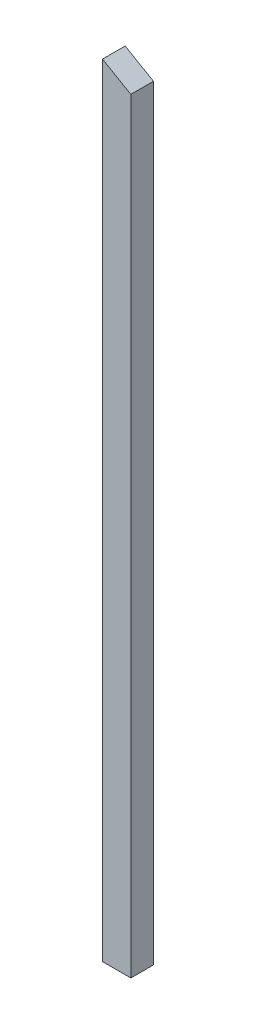
ISO-10303-21;
HEADER;
FILE_DESCRIPTION(('STEP AP214'),'2;1');
FILE_NAME('part.step','',(''),(''),'','','');
FILE_SCHEMA(('AUTOMOTIVE_DESIGN { 1 0 10303 214 1 1 1 1 }'));
ENDSEC;
DATA;
#1=APPLICATION_CONTEXT('core data for automotive mechanical design processes');
#2=APPLICATION_PROTOCOL_DEFINITION('international standard','automotive_design',2000,#1);
#3=PRODUCT_CONTEXT('',#1,'mechanical');
#4=PRODUCT('Part','Part','',(#3));
#5=PRODUCT_RELATED_PRODUCT_CATEGORY('part','',(#4));
#6=PRODUCT_DEFINITION_FORMATION('','',#4);
#7=PRODUCT_DEFINITION_CONTEXT('part definition',#1,'design');
#8=PRODUCT_DEFINITION('design','',#6,#7);
#9=PRODUCT_DEFINITION_SHAPE('','',#8);
#10=(LENGTH_UNIT() NAMED_UNIT(*) SI_UNIT(.MILLI.,.METRE.));
#11=(NAMED_UNIT(*) PLANE_ANGLE_UNIT() SI_UNIT($,.RADIAN.));
#12=(NAMED_UNIT(*) SI_UNIT($,.STERADIAN.) SOLID_ANGLE_UNIT());
#13=UNCERTAINTY_MEASURE_WITH_UNIT(LENGTH_MEASURE(1.E-05),#10,'distance_accuracy_value','');
#14=(GEOMETRIC_REPRESENTATION_CONTEXT(3) GLOBAL_UNCERTAINTY_ASSIGNED_CONTEXT((#13)) GLOBAL_UNIT_ASSIGNED_CONTEXT((#10,
#11,#12)) REPRESENTATION_CONTEXT('',''));
#15=CARTESIAN_POINT('',(0.,0.,0.));
#16=DIRECTION('',(0.,0.,1.));
#17=DIRECTION('',(1.,0.,0.));
#18=AXIS2_PLACEMENT_3D('',#15,#16,#17);
#19=CARTESIAN_POINT('',(0.,0.,40.));
#20=DIRECTION('',(1.,0.,0.));
#21=DIRECTION('',(0.,0.,-1.));
#22=AXIS2_PLACEMENT_3D('',#19,#20,#21);
#23=PLANE('',#22);
#24=DIRECTION('',(0.,-1.,0.));
#25=VECTOR('',#24,1.);
#26=CARTESIAN_POINT('',(0.,0.,0.));
#27=LINE('',#26,#25);
#28=CARTESIAN_POINT('',(0.,1378.86751345948,0.));
#29=VERTEX_POINT('',#28);
#30=CARTESIAN_POINT('',(0.,0.,0.));
#31=VERTEX_POINT('',#30);
#32=EDGE_CURVE('E90',#29,#31,#27,.T.);
#33=ORIENTED_EDGE('',*,*,#32,.T.);
#34=DIRECTION('',(0.,0.,-1.));
#35=VECTOR('',#34,1.);
#36=CARTESIAN_POINT('',(0.,0.,40.));
#37=LINE('',#36,#35);
#38=CARTESIAN_POINT('',(0.,0.,40.));
#39=VERTEX_POINT('',#38);
#40=EDGE_CURVE('E11',#39,#31,#37,.T.);
#41=ORIENTED_EDGE('',*,*,#40,.F.);
#42=DIRECTION('',(0.,-1.,0.));
#43=VECTOR('',#42,1.);
#44=CARTESIAN_POINT('',(0.,0.,40.));
#45=LINE('',#44,#43);
#46=CARTESIAN_POINT('',(0.,1378.86751345948,40.));
#47=VERTEX_POINT('',#46);
#48=EDGE_CURVE('E81',#47,#39,#45,.T.);
#49=ORIENTED_EDGE('',*,*,#48,.F.);
#50=DIRECTION('',(0.,0.,1.));
#51=VECTOR('',#50,1.);
#52=CARTESIAN_POINT('',(0.,1378.86751345948,0.));
#53=LINE('',#52,#51);
#54=EDGE_CURVE('E91',#29,#47,#53,.T.);
#55=ORIENTED_EDGE('',*,*,#54,.F.);
#56=EDGE_LOOP('',(#33,#41,#49,#55));
#57=FACE_BOUND('',#56,.T.);
#58=ADVANCED_FACE('F33',(#57),#23,.F.);
#59=CARTESIAN_POINT('',(0.,0.,40.));
#60=DIRECTION('',(0.,1.,0.));
#61=DIRECTION('',(0.,0.,1.));
#62=AXIS2_PLACEMENT_3D('',#59,#60,#61);
#63=PLANE('',#62);
#64=DIRECTION('',(1.,0.,0.));
#65=VECTOR('',#64,1.);
#66=CARTESIAN_POINT('',(0.,0.,0.));
#67=LINE('',#66,#65);
#68=CARTESIAN_POINT('',(50.,0.,0.));
#69=VERTEX_POINT('',#68);
#70=EDGE_CURVE('E61',#31,#69,#67,.T.);
#71=ORIENTED_EDGE('',*,*,#70,.T.);
#72=DIRECTION('',(0.,0.,-1.));
#73=VECTOR('',#72,1.);
#74=CARTESIAN_POINT('',(50.,0.,40.));
#75=LINE('',#74,#73);
#76=CARTESIAN_POINT('',(50.,0.,40.));
#77=VERTEX_POINT('',#76);
#78=EDGE_CURVE('E41',#77,#69,#75,.T.);
#79=ORIENTED_EDGE('',*,*,#78,.F.);
#80=DIRECTION('',(1.,0.,0.));
#81=VECTOR('',#80,1.);
#82=CARTESIAN_POINT('',(0.,0.,40.));
#83=LINE('',#82,#81);
#84=EDGE_CURVE('E76',#39,#77,#83,.T.);
#85=ORIENTED_EDGE('',*,*,#84,.F.);
#86=ORIENTED_EDGE('',*,*,#40,.T.);
#87=EDGE_LOOP('',(#71,#79,#85,#86));
#88=FACE_BOUND('',#87,.T.);
#89=ADVANCED_FACE('F78',(#88),#63,.F.);
#90=CARTESIAN_POINT('',(50.,0.,40.));
#91=DIRECTION('',(-1.,0.,0.));
#92=DIRECTION('',(0.,0.,1.));
#93=AXIS2_PLACEMENT_3D('',#90,#91,#92);
#94=PLANE('',#93);
#95=DIRECTION('',(0.,1.,0.));
#96=VECTOR('',#95,1.);
#97=CARTESIAN_POINT('',(50.,0.,0.));
#98=LINE('',#97,#96);
#99=CARTESIAN_POINT('',(50.,1350.,0.));
#100=VERTEX_POINT('',#99);
#101=EDGE_CURVE('E67',#69,#100,#98,.T.);
#102=ORIENTED_EDGE('',*,*,#101,.T.);
#103=DIRECTION('',(0.,0.,-1.));
#104=VECTOR('',#103,1.);
#105=CARTESIAN_POINT('',(50.,1350.,40.));
#106=LINE('',#105,#104);
#107=CARTESIAN_POINT('',(50.,1350.,40.));
#108=VERTEX_POINT('',#107);
#109=EDGE_CURVE('E101',#108,#100,#106,.T.);
#110=ORIENTED_EDGE('',*,*,#109,.F.);
#111=DIRECTION('',(0.,1.,0.));
#112=VECTOR('',#111,1.);
#113=CARTESIAN_POINT('',(50.,0.,40.));
#114=LINE('',#113,#112);
#115=EDGE_CURVE('E49',#77,#108,#114,.T.);
#116=ORIENTED_EDGE('',*,*,#115,.F.);
#117=ORIENTED_EDGE('',*,*,#78,.T.);
#118=EDGE_LOOP('',(#102,#110,#116,#117));
#119=FACE_BOUND('',#118,.T.);
#120=ADVANCED_FACE('F102',(#119),#94,.F.);
#121=CARTESIAN_POINT('',(0.,0.,40.));
#122=DIRECTION('',(0.,0.,-1.));
#123=DIRECTION('',(-1.,0.,0.));
#124=AXIS2_PLACEMENT_3D('',#121,#122,#123);
#125=PLANE('',#124);
#126=ORIENTED_EDGE('',*,*,#48,.T.);
#127=ORIENTED_EDGE('',*,*,#84,.T.);
#128=ORIENTED_EDGE('',*,*,#115,.T.);
#129=DIRECTION('',(-0.866025403784441,0.499999999999995,0.));
#130=VECTOR('',#129,1.);
#131=CARTESIAN_POINT('',(0.,1378.86751345948,40.));
#132=LINE('',#131,#130);
#133=EDGE_CURVE('E85',#108,#47,#132,.T.);
#134=ORIENTED_EDGE('',*,*,#133,.T.);
#135=EDGE_LOOP('',(#126,#127,#128,#134));
#136=FACE_BOUND('',#135,.T.);
#137=ADVANCED_FACE('F83',(#136),#125,.F.);
#138=CARTESIAN_POINT('',(0.,0.,0.));
#139=DIRECTION('',(0.,0.,-1.));
#140=DIRECTION('',(-1.,0.,0.));
#141=AXIS2_PLACEMENT_3D('',#138,#139,#140);
#142=PLANE('',#141);
#143=ORIENTED_EDGE('',*,*,#32,.F.);
#144=DIRECTION('',(-0.866025403784441,0.499999999999995,0.));
#145=VECTOR('',#144,1.);
#146=CARTESIAN_POINT('',(0.,1378.86751345948,0.));
#147=LINE('',#146,#145);
#148=EDGE_CURVE('E96',#100,#29,#147,.T.);
#149=ORIENTED_EDGE('',*,*,#148,.F.);
#150=ORIENTED_EDGE('',*,*,#101,.F.);
#151=ORIENTED_EDGE('',*,*,#70,.F.);
#152=EDGE_LOOP('',(#143,#149,#150,#151));
#153=FACE_BOUND('',#152,.T.);
#154=ADVANCED_FACE('F103',(#153),#142,.T.);
#155=CARTESIAN_POINT('',(0.,1378.86751345948,0.));
#156=DIRECTION('',(0.499999999999995,0.866025403784441,0.));
#157=DIRECTION('',(-0.866025403784441,0.499999999999995,0.));
#158=AXIS2_PLACEMENT_3D('',#155,#156,#157);
#159=PLANE('',#158);
#160=ORIENTED_EDGE('',*,*,#133,.F.);
#161=ORIENTED_EDGE('',*,*,#109,.T.);
#162=ORIENTED_EDGE('',*,*,#148,.T.);
#163=ORIENTED_EDGE('',*,*,#54,.T.);
#164=EDGE_LOOP('',(#160,#161,#162,#163));
#165=FACE_BOUND('',#164,.T.);
#166=ADVANCED_FACE('F107',(#165),#159,.T.);
#167=CLOSED_SHELL('',(#58,#89,#120,#137,#154,#166));
#168=MANIFOLD_SOLID_BREP('B2',#167);
#169=ADVANCED_BREP_SHAPE_REPRESENTATION('',(#18,#168),#14);
#170=SHAPE_DEFINITION_REPRESENTATION(#9,#169);
ENDSEC;
END-ISO-10303-21;
